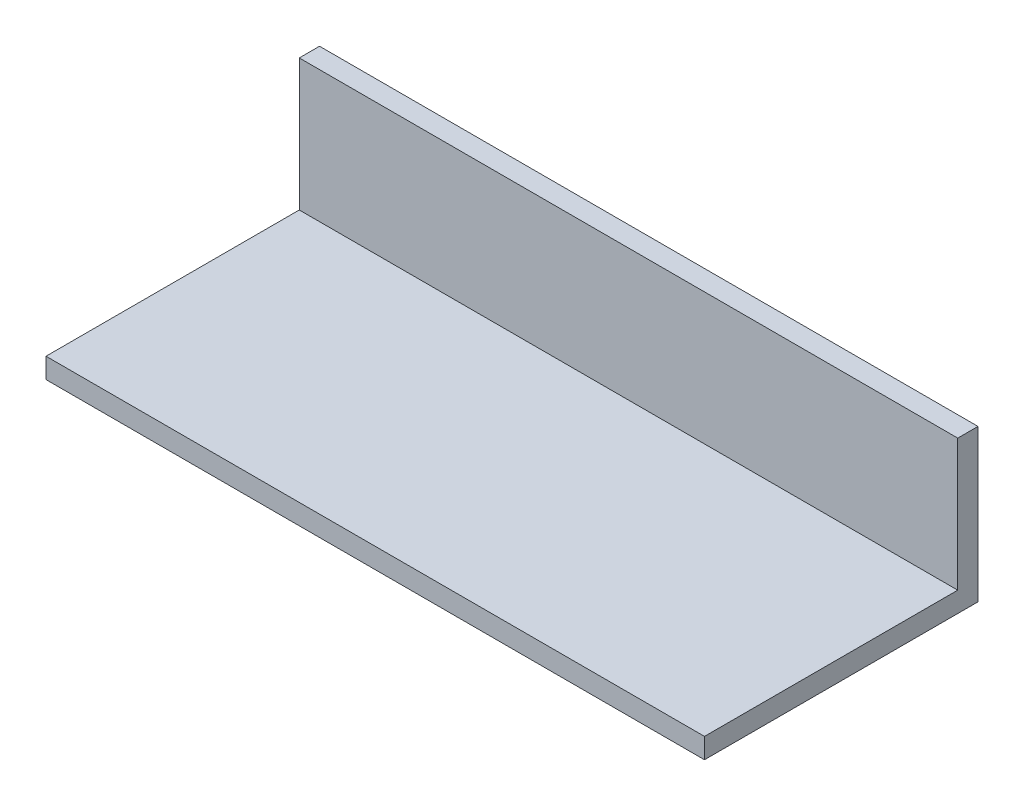
ISO-10303-21;
HEADER;
FILE_DESCRIPTION(('STEP AP214'),'2;1');
FILE_NAME('part.step','',(''),(''),'','','');
FILE_SCHEMA(('AUTOMOTIVE_DESIGN { 1 0 10303 214 1 1 1 1 }'));
ENDSEC;
DATA;
#1=APPLICATION_CONTEXT('core data for automotive mechanical design processes');
#2=APPLICATION_PROTOCOL_DEFINITION('international standard','automotive_design',2000,#1);
#3=PRODUCT_CONTEXT('',#1,'mechanical');
#4=PRODUCT('Part','Part','',(#3));
#5=PRODUCT_RELATED_PRODUCT_CATEGORY('part','',(#4));
#6=PRODUCT_DEFINITION_FORMATION('','',#4);
#7=PRODUCT_DEFINITION_CONTEXT('part definition',#1,'design');
#8=PRODUCT_DEFINITION('design','',#6,#7);
#9=PRODUCT_DEFINITION_SHAPE('','',#8);
#10=(LENGTH_UNIT() NAMED_UNIT(*) SI_UNIT(.MILLI.,.METRE.));
#11=(NAMED_UNIT(*) PLANE_ANGLE_UNIT() SI_UNIT($,.RADIAN.));
#12=(NAMED_UNIT(*) SI_UNIT($,.STERADIAN.) SOLID_ANGLE_UNIT());
#13=UNCERTAINTY_MEASURE_WITH_UNIT(LENGTH_MEASURE(1.E-05),#10,'distance_accuracy_value','');
#14=(GEOMETRIC_REPRESENTATION_CONTEXT(3) GLOBAL_UNCERTAINTY_ASSIGNED_CONTEXT((#13)) GLOBAL_UNIT_ASSIGNED_CONTEXT((#10,
#11,#12)) REPRESENTATION_CONTEXT('',''));
#15=CARTESIAN_POINT('',(0.,0.,0.));
#16=DIRECTION('',(0.,0.,1.));
#17=DIRECTION('',(1.,0.,0.));
#18=AXIS2_PLACEMENT_3D('',#15,#16,#17);
#19=CARTESIAN_POINT('',(-23.6607142857143,2.,-12.4553571428571));
#20=DIRECTION('',(1.,0.,0.));
#21=DIRECTION('',(0.,0.,-1.));
#22=AXIS2_PLACEMENT_3D('',#19,#20,#21);
#23=PLANE('',#22);
#24=DIRECTION('',(0.,0.,1.));
#25=VECTOR('',#24,1.);
#26=CARTESIAN_POINT('',(-23.6607142857143,0.,-12.4553571428571));
#27=LINE('',#26,#25);
#28=CARTESIAN_POINT('',(-23.6607142857143,0.,-14.4553571428571));
#29=VERTEX_POINT('',#28);
#30=CARTESIAN_POINT('',(-23.6607142857143,0.,12.5446428571429));
#31=VERTEX_POINT('',#30);
#32=EDGE_CURVE('E97',#29,#31,#27,.T.);
#33=ORIENTED_EDGE('',*,*,#32,.T.);
#34=DIRECTION('',(0.,-1.,0.));
#35=VECTOR('',#34,1.);
#36=CARTESIAN_POINT('',(-23.6607142857143,2.,12.5446428571429));
#37=LINE('',#36,#35);
#38=CARTESIAN_POINT('',(-23.6607142857143,2.,12.5446428571429));
#39=VERTEX_POINT('',#38);
#40=EDGE_CURVE('E11',#39,#31,#37,.T.);
#41=ORIENTED_EDGE('',*,*,#40,.F.);
#42=DIRECTION('',(0.,0.,1.));
#43=VECTOR('',#42,1.);
#44=CARTESIAN_POINT('',(-23.6607142857143,2.,-12.4553571428571));
#45=LINE('',#44,#43);
#46=CARTESIAN_POINT('',(-23.6607142857143,2.,-12.4553571428571));
#47=VERTEX_POINT('',#46);
#48=EDGE_CURVE('E57',#47,#39,#45,.T.);
#49=ORIENTED_EDGE('',*,*,#48,.F.);
#50=DIRECTION('',(0.,1.,0.));
#51=VECTOR('',#50,1.);
#52=CARTESIAN_POINT('',(-23.6607142857143,0.,-12.4553571428571));
#53=LINE('',#52,#51);
#54=CARTESIAN_POINT('',(-23.6607142857143,15.,-12.4553571428571));
#55=VERTEX_POINT('',#54);
#56=EDGE_CURVE('E126',#47,#55,#53,.T.);
#57=ORIENTED_EDGE('',*,*,#56,.T.);
#58=DIRECTION('',(0.,0.,1.));
#59=VECTOR('',#58,1.);
#60=CARTESIAN_POINT('',(-23.6607142857143,15.,-14.4553571428571));
#61=LINE('',#60,#59);
#62=CARTESIAN_POINT('',(-23.6607142857143,15.,-14.4553571428571));
#63=VERTEX_POINT('',#62);
#64=EDGE_CURVE('E103',#63,#55,#61,.T.);
#65=ORIENTED_EDGE('',*,*,#64,.F.);
#66=DIRECTION('',(0.,1.,0.));
#67=VECTOR('',#66,1.);
#68=CARTESIAN_POINT('',(-23.6607142857143,0.,-14.4553571428571));
#69=LINE('',#68,#67);
#70=EDGE_CURVE('E100',#29,#63,#69,.T.);
#71=ORIENTED_EDGE('',*,*,#70,.F.);
#72=EDGE_LOOP('',(#33,#41,#49,#57,#65,#71));
#73=FACE_BOUND('',#72,.T.);
#74=ADVANCED_FACE('F41',(#73),#23,.F.);
#75=CARTESIAN_POINT('',(-23.6607142857143,2.,12.5446428571429));
#76=DIRECTION('',(0.,0.,-1.));
#77=DIRECTION('',(-1.,0.,0.));
#78=AXIS2_PLACEMENT_3D('',#75,#76,#77);
#79=PLANE('',#78);
#80=DIRECTION('',(1.,0.,0.));
#81=VECTOR('',#80,1.);
#82=CARTESIAN_POINT('',(-23.6607142857143,0.,12.5446428571429));
#83=LINE('',#82,#81);
#84=CARTESIAN_POINT('',(41.3392857142857,0.,12.5446428571429));
#85=VERTEX_POINT('',#84);
#86=EDGE_CURVE('E70',#31,#85,#83,.T.);
#87=ORIENTED_EDGE('',*,*,#86,.T.);
#88=DIRECTION('',(0.,-1.,0.));
#89=VECTOR('',#88,1.);
#90=CARTESIAN_POINT('',(41.3392857142857,2.,12.5446428571429));
#91=LINE('',#90,#89);
#92=CARTESIAN_POINT('',(41.3392857142857,2.,12.5446428571429));
#93=VERTEX_POINT('',#92);
#94=EDGE_CURVE('E49',#93,#85,#91,.T.);
#95=ORIENTED_EDGE('',*,*,#94,.F.);
#96=DIRECTION('',(1.,0.,0.));
#97=VECTOR('',#96,1.);
#98=CARTESIAN_POINT('',(-23.6607142857143,2.,12.5446428571429));
#99=LINE('',#98,#97);
#100=EDGE_CURVE('E87',#39,#93,#99,.T.);
#101=ORIENTED_EDGE('',*,*,#100,.F.);
#102=ORIENTED_EDGE('',*,*,#40,.T.);
#103=EDGE_LOOP('',(#87,#95,#101,#102));
#104=FACE_BOUND('',#103,.T.);
#105=ADVANCED_FACE('F88',(#104),#79,.F.);
#106=CARTESIAN_POINT('',(41.3392857142857,2.,-12.4553571428571));
#107=DIRECTION('',(1.,0.,0.));
#108=DIRECTION('',(0.,0.,-1.));
#109=AXIS2_PLACEMENT_3D('',#106,#107,#108);
#110=PLANE('',#109);
#111=DIRECTION('',(0.,0.,1.));
#112=VECTOR('',#111,1.);
#113=CARTESIAN_POINT('',(41.3392857142857,0.,-12.4553571428571));
#114=LINE('',#113,#112);
#115=CARTESIAN_POINT('',(41.3392857142857,0.,-14.4553571428571));
#116=VERTEX_POINT('',#115);
#117=EDGE_CURVE('E94',#116,#85,#114,.T.);
#118=ORIENTED_EDGE('',*,*,#117,.F.);
#119=DIRECTION('',(0.,-1.,0.));
#120=VECTOR('',#119,1.);
#121=CARTESIAN_POINT('',(41.3392857142857,0.,-14.4553571428571));
#122=LINE('',#121,#120);
#123=CARTESIAN_POINT('',(41.3392857142857,15.,-14.4553571428571));
#124=VERTEX_POINT('',#123);
#125=EDGE_CURVE('E129',#124,#116,#122,.T.);
#126=ORIENTED_EDGE('',*,*,#125,.F.);
#127=DIRECTION('',(0.,0.,1.));
#128=VECTOR('',#127,1.);
#129=CARTESIAN_POINT('',(41.3392857142857,15.,-14.4553571428571));
#130=LINE('',#129,#128);
#131=CARTESIAN_POINT('',(41.3392857142857,15.,-12.4553571428571));
#132=VERTEX_POINT('',#131);
#133=EDGE_CURVE('E107',#124,#132,#130,.T.);
#134=ORIENTED_EDGE('',*,*,#133,.T.);
#135=DIRECTION('',(0.,-1.,0.));
#136=VECTOR('',#135,1.);
#137=CARTESIAN_POINT('',(41.3392857142857,0.,-12.4553571428571));
#138=LINE('',#137,#136);
#139=CARTESIAN_POINT('',(41.3392857142857,2.,-12.4553571428571));
#140=VERTEX_POINT('',#139);
#141=EDGE_CURVE('E121',#132,#140,#138,.T.);
#142=ORIENTED_EDGE('',*,*,#141,.T.);
#143=DIRECTION('',(0.,0.,1.));
#144=VECTOR('',#143,1.);
#145=CARTESIAN_POINT('',(41.3392857142857,2.,-12.4553571428571));
#146=LINE('',#145,#144);
#147=EDGE_CURVE('E77',#140,#93,#146,.T.);
#148=ORIENTED_EDGE('',*,*,#147,.T.);
#149=ORIENTED_EDGE('',*,*,#94,.T.);
#150=EDGE_LOOP('',(#118,#126,#134,#142,#148,#149));
#151=FACE_BOUND('',#150,.T.);
#152=ADVANCED_FACE('F149',(#151),#110,.T.);
#153=CARTESIAN_POINT('',(0.,2.,0.));
#154=DIRECTION('',(0.,1.,0.));
#155=DIRECTION('',(0.,0.,1.));
#156=AXIS2_PLACEMENT_3D('',#153,#154,#155);
#157=PLANE('',#156);
#158=ORIENTED_EDGE('',*,*,#48,.T.);
#159=ORIENTED_EDGE('',*,*,#100,.T.);
#160=ORIENTED_EDGE('',*,*,#147,.F.);
#161=DIRECTION('',(1.,0.,0.));
#162=VECTOR('',#161,1.);
#163=CARTESIAN_POINT('',(-23.6607142857143,2.,-12.4553571428571));
#164=LINE('',#163,#162);
#165=EDGE_CURVE('E92',#47,#140,#164,.T.);
#166=ORIENTED_EDGE('',*,*,#165,.F.);
#167=EDGE_LOOP('',(#158,#159,#160,#166));
#168=FACE_BOUND('',#167,.T.);
#169=ADVANCED_FACE('F91',(#168),#157,.T.);
#170=CARTESIAN_POINT('',(0.,0.,0.));
#171=DIRECTION('',(0.,1.,0.));
#172=DIRECTION('',(0.,0.,1.));
#173=AXIS2_PLACEMENT_3D('',#170,#171,#172);
#174=PLANE('',#173);
#175=ORIENTED_EDGE('',*,*,#32,.F.);
#176=DIRECTION('',(-1.,0.,0.));
#177=VECTOR('',#176,1.);
#178=CARTESIAN_POINT('',(-23.6607142857143,0.,-14.4553571428571));
#179=LINE('',#178,#177);
#180=EDGE_CURVE('E120',#116,#29,#179,.T.);
#181=ORIENTED_EDGE('',*,*,#180,.F.);
#182=ORIENTED_EDGE('',*,*,#117,.T.);
#183=ORIENTED_EDGE('',*,*,#86,.F.);
#184=EDGE_LOOP('',(#175,#181,#182,#183));
#185=FACE_BOUND('',#184,.T.);
#186=ADVANCED_FACE('F150',(#185),#174,.F.);
#187=CARTESIAN_POINT('',(0.,0.,-12.4553571428571));
#188=DIRECTION('',(0.,0.,-1.));
#189=DIRECTION('',(-1.,0.,0.));
#190=AXIS2_PLACEMENT_3D('',#187,#188,#189);
#191=PLANE('',#190);
#192=ORIENTED_EDGE('',*,*,#56,.F.);
#193=ORIENTED_EDGE('',*,*,#165,.T.);
#194=ORIENTED_EDGE('',*,*,#141,.F.);
#195=DIRECTION('',(1.,0.,0.));
#196=VECTOR('',#195,1.);
#197=CARTESIAN_POINT('',(-23.6607142857143,15.,-12.4553571428571));
#198=LINE('',#197,#196);
#199=EDGE_CURVE('E123',#55,#132,#198,.T.);
#200=ORIENTED_EDGE('',*,*,#199,.F.);
#201=EDGE_LOOP('',(#192,#193,#194,#200));
#202=FACE_BOUND('',#201,.T.);
#203=ADVANCED_FACE('F152',(#202),#191,.F.);
#204=CARTESIAN_POINT('',(-23.6607142857143,15.,-14.4553571428571));
#205=DIRECTION('',(0.,-1.,0.));
#206=DIRECTION('',(1.,0.,0.));
#207=AXIS2_PLACEMENT_3D('',#204,#205,#206);
#208=PLANE('',#207);
#209=ORIENTED_EDGE('',*,*,#199,.T.);
#210=ORIENTED_EDGE('',*,*,#133,.F.);
#211=DIRECTION('',(1.,0.,0.));
#212=VECTOR('',#211,1.);
#213=CARTESIAN_POINT('',(-23.6607142857143,15.,-14.4553571428571));
#214=LINE('',#213,#212);
#215=EDGE_CURVE('E132',#63,#124,#214,.T.);
#216=ORIENTED_EDGE('',*,*,#215,.F.);
#217=ORIENTED_EDGE('',*,*,#64,.T.);
#218=EDGE_LOOP('',(#209,#210,#216,#217));
#219=FACE_BOUND('',#218,.T.);
#220=ADVANCED_FACE('F145',(#219),#208,.F.);
#221=CARTESIAN_POINT('',(0.,0.,-14.4553571428571));
#222=DIRECTION('',(0.,0.,-1.));
#223=DIRECTION('',(-1.,0.,0.));
#224=AXIS2_PLACEMENT_3D('',#221,#222,#223);
#225=PLANE('',#224);
#226=ORIENTED_EDGE('',*,*,#70,.T.);
#227=ORIENTED_EDGE('',*,*,#215,.T.);
#228=ORIENTED_EDGE('',*,*,#125,.T.);
#229=ORIENTED_EDGE('',*,*,#180,.T.);
#230=EDGE_LOOP('',(#226,#227,#228,#229));
#231=FACE_BOUND('',#230,.T.);
#232=ADVANCED_FACE('F137',(#231),#225,.T.);
#233=CLOSED_SHELL('',(#74,#105,#152,#169,#186,#203,#220,#232));
#234=MANIFOLD_SOLID_BREP('B2',#233);
#235=ADVANCED_BREP_SHAPE_REPRESENTATION('',(#18,#234),#14);
#236=SHAPE_DEFINITION_REPRESENTATION(#9,#235);
ENDSEC;
END-ISO-10303-21;
